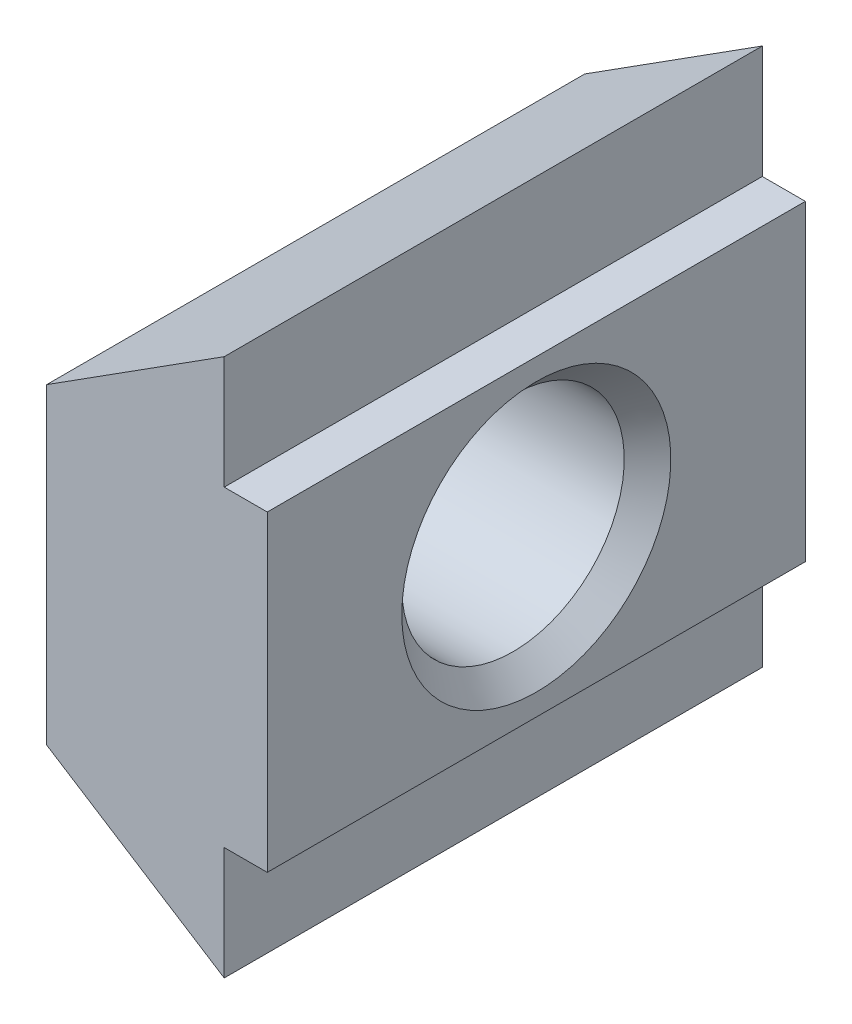
ISO-10303-21;
HEADER;
FILE_DESCRIPTION(('STEP AP214'),'2;1');
FILE_NAME('part.step','',(''),(''),'','','');
FILE_SCHEMA(('AUTOMOTIVE_DESIGN { 1 0 10303 214 1 1 1 1 }'));
ENDSEC;
DATA;
#1=APPLICATION_CONTEXT('core data for automotive mechanical design processes');
#2=APPLICATION_PROTOCOL_DEFINITION('international standard','automotive_design',2000,#1);
#3=PRODUCT_CONTEXT('',#1,'mechanical');
#4=PRODUCT('Part','Part','',(#3));
#5=PRODUCT_RELATED_PRODUCT_CATEGORY('part','',(#4));
#6=PRODUCT_DEFINITION_FORMATION('','',#4);
#7=PRODUCT_DEFINITION_CONTEXT('part definition',#1,'design');
#8=PRODUCT_DEFINITION('design','',#6,#7);
#9=PRODUCT_DEFINITION_SHAPE('','',#8);
#10=(LENGTH_UNIT() NAMED_UNIT(*) SI_UNIT(.MILLI.,.METRE.));
#11=(NAMED_UNIT(*) PLANE_ANGLE_UNIT() SI_UNIT($,.RADIAN.));
#12=(NAMED_UNIT(*) SI_UNIT($,.STERADIAN.) SOLID_ANGLE_UNIT());
#13=UNCERTAINTY_MEASURE_WITH_UNIT(LENGTH_MEASURE(1.E-05),#10,'distance_accuracy_value','');
#14=(GEOMETRIC_REPRESENTATION_CONTEXT(3) GLOBAL_UNCERTAINTY_ASSIGNED_CONTEXT((#13)) GLOBAL_UNIT_ASSIGNED_CONTEXT((#10,
#11,#12)) REPRESENTATION_CONTEXT('',''));
#15=CARTESIAN_POINT('',(0.,0.,0.));
#16=DIRECTION('',(0.,0.,1.));
#17=DIRECTION('',(1.,0.,0.));
#18=AXIS2_PLACEMENT_3D('',#15,#16,#17);
#19=CARTESIAN_POINT('',(-4.1,2.9,5.));
#20=DIRECTION('',(1.,0.,0.));
#21=DIRECTION('',(0.,0.,-1.));
#22=AXIS2_PLACEMENT_3D('',#19,#20,#21);
#23=PLANE('',#22);
#24=CARTESIAN_POINT('',(-4.1,0.,0.));
#25=DIRECTION('',(-1.,0.,0.));
#26=DIRECTION('',(0.,0.,1.));
#27=AXIS2_PLACEMENT_3D('',#24,#25,#26);
#28=CIRCLE('',#27,2.5);
#29=CARTESIAN_POINT('',(-4.1,0.,2.5));
#30=VERTEX_POINT('',#29);
#31=EDGE_CURVE('E122',#30,#30,#28,.T.);
#32=ORIENTED_EDGE('',*,*,#31,.F.);
#33=EDGE_LOOP('',(#32));
#34=FACE_BOUND('',#33,.T.);
#35=DIRECTION('',(0.,0.,-1.));
#36=VECTOR('',#35,1.);
#37=CARTESIAN_POINT('',(-4.1,2.9,5.));
#38=LINE('',#37,#36);
#39=CARTESIAN_POINT('',(-4.1,2.9,5.));
#40=VERTEX_POINT('',#39);
#41=CARTESIAN_POINT('',(-4.1,2.9,-5.));
#42=VERTEX_POINT('',#41);
#43=EDGE_CURVE('E121',#40,#42,#38,.T.);
#44=ORIENTED_EDGE('',*,*,#43,.T.);
#45=DIRECTION('',(0.,-1.,0.));
#46=VECTOR('',#45,1.);
#47=CARTESIAN_POINT('',(-4.1,2.9,-5.));
#48=LINE('',#47,#46);
#49=CARTESIAN_POINT('',(-4.1,-2.9,-5.));
#50=VERTEX_POINT('',#49);
#51=EDGE_CURVE('E115',#42,#50,#48,.T.);
#52=ORIENTED_EDGE('',*,*,#51,.T.);
#53=DIRECTION('',(0.,0.,-1.));
#54=VECTOR('',#53,1.);
#55=CARTESIAN_POINT('',(-4.1,-2.9,5.));
#56=LINE('',#55,#54);
#57=CARTESIAN_POINT('',(-4.1,-2.9,5.));
#58=VERTEX_POINT('',#57);
#59=EDGE_CURVE('E11',#58,#50,#56,.T.);
#60=ORIENTED_EDGE('',*,*,#59,.F.);
#61=DIRECTION('',(0.,-1.,0.));
#62=VECTOR('',#61,1.);
#63=CARTESIAN_POINT('',(-4.1,2.9,5.));
#64=LINE('',#63,#62);
#65=EDGE_CURVE('E144',#40,#58,#64,.T.);
#66=ORIENTED_EDGE('',*,*,#65,.F.);
#67=EDGE_LOOP('',(#44,#52,#60,#66));
#68=FACE_BOUND('',#67,.T.);
#69=ADVANCED_FACE('F39',(#34,#68),#23,.F.);
#70=CARTESIAN_POINT('',(-4.1,-2.9,5.));
#71=DIRECTION('',(0.536875492193159,0.843661487732107,0.));
#72=DIRECTION('',(-0.843661487732107,0.536875492193159,0.));
#73=AXIS2_PLACEMENT_3D('',#70,#71,#72);
#74=PLANE('',#73);
#75=ORIENTED_EDGE('',*,*,#59,.T.);
#76=DIRECTION('',(0.843661487732107,-0.536875492193159,0.));
#77=VECTOR('',#76,1.);
#78=CARTESIAN_POINT('',(-4.1,-2.9,-5.));
#79=LINE('',#78,#77);
#80=CARTESIAN_POINT('',(-0.800000000000001,-5.,-5.));
#81=VERTEX_POINT('',#80);
#82=EDGE_CURVE('E105',#50,#81,#79,.T.);
#83=ORIENTED_EDGE('',*,*,#82,.T.);
#84=DIRECTION('',(0.,0.,-1.));
#85=VECTOR('',#84,1.);
#86=CARTESIAN_POINT('',(-0.800000000000001,-5.,5.));
#87=LINE('',#86,#85);
#88=CARTESIAN_POINT('',(-0.800000000000001,-5.,5.));
#89=VERTEX_POINT('',#88);
#90=EDGE_CURVE('E46',#89,#81,#87,.T.);
#91=ORIENTED_EDGE('',*,*,#90,.F.);
#92=DIRECTION('',(0.843661487732107,-0.536875492193159,0.));
#93=VECTOR('',#92,1.);
#94=CARTESIAN_POINT('',(-4.1,-2.9,5.));
#95=LINE('',#94,#93);
#96=EDGE_CURVE('E106',#58,#89,#95,.T.);
#97=ORIENTED_EDGE('',*,*,#96,.F.);
#98=EDGE_LOOP('',(#75,#83,#91,#97));
#99=FACE_BOUND('',#98,.T.);
#100=ADVANCED_FACE('F103',(#99),#74,.F.);
#101=CARTESIAN_POINT('',(-0.800000000000001,-5.,5.));
#102=DIRECTION('',(-1.,0.,0.));
#103=DIRECTION('',(0.,0.,1.));
#104=AXIS2_PLACEMENT_3D('',#101,#102,#103);
#105=PLANE('',#104);
#106=ORIENTED_EDGE('',*,*,#90,.T.);
#107=DIRECTION('',(0.,1.,0.));
#108=VECTOR('',#107,1.);
#109=CARTESIAN_POINT('',(-0.800000000000001,-5.,-5.));
#110=LINE('',#109,#108);
#111=CARTESIAN_POINT('',(-0.800000000000001,-2.9,-5.));
#112=VERTEX_POINT('',#111);
#113=EDGE_CURVE('E119',#81,#112,#110,.T.);
#114=ORIENTED_EDGE('',*,*,#113,.T.);
#115=DIRECTION('',(0.,0.,-1.));
#116=VECTOR('',#115,1.);
#117=CARTESIAN_POINT('',(-0.800000000000001,-2.9,5.));
#118=LINE('',#117,#116);
#119=CARTESIAN_POINT('',(-0.800000000000001,-2.9,5.));
#120=VERTEX_POINT('',#119);
#121=EDGE_CURVE('E166',#120,#112,#118,.T.);
#122=ORIENTED_EDGE('',*,*,#121,.F.);
#123=DIRECTION('',(0.,1.,0.));
#124=VECTOR('',#123,1.);
#125=CARTESIAN_POINT('',(-0.800000000000001,-5.,5.));
#126=LINE('',#125,#124);
#127=EDGE_CURVE('E147',#89,#120,#126,.T.);
#128=ORIENTED_EDGE('',*,*,#127,.F.);
#129=EDGE_LOOP('',(#106,#114,#122,#128));
#130=FACE_BOUND('',#129,.T.);
#131=ADVANCED_FACE('F169',(#130),#105,.F.);
#132=CARTESIAN_POINT('',(-0.800000000000001,-2.9,5.));
#133=DIRECTION('',(0.,1.,0.));
#134=DIRECTION('',(0.,0.,1.));
#135=AXIS2_PLACEMENT_3D('',#132,#133,#134);
#136=PLANE('',#135);
#137=ORIENTED_EDGE('',*,*,#121,.T.);
#138=DIRECTION('',(1.,0.,0.));
#139=VECTOR('',#138,1.);
#140=CARTESIAN_POINT('',(-0.800000000000001,-2.9,-5.));
#141=LINE('',#140,#139);
#142=CARTESIAN_POINT('',(0.,-2.9,-5.));
#143=VERTEX_POINT('',#142);
#144=EDGE_CURVE('E130',#112,#143,#141,.T.);
#145=ORIENTED_EDGE('',*,*,#144,.T.);
#146=DIRECTION('',(0.,0.,-1.));
#147=VECTOR('',#146,1.);
#148=CARTESIAN_POINT('',(0.,-2.9,5.));
#149=LINE('',#148,#147);
#150=CARTESIAN_POINT('',(0.,-2.9,5.));
#151=VERTEX_POINT('',#150);
#152=EDGE_CURVE('E164',#151,#143,#149,.T.);
#153=ORIENTED_EDGE('',*,*,#152,.F.);
#154=DIRECTION('',(1.,0.,0.));
#155=VECTOR('',#154,1.);
#156=CARTESIAN_POINT('',(-0.800000000000001,-2.9,5.));
#157=LINE('',#156,#155);
#158=EDGE_CURVE('E149',#120,#151,#157,.T.);
#159=ORIENTED_EDGE('',*,*,#158,.F.);
#160=EDGE_LOOP('',(#137,#145,#153,#159));
#161=FACE_BOUND('',#160,.T.);
#162=ADVANCED_FACE('F177',(#161),#136,.F.);
#163=CARTESIAN_POINT('',(0.,-2.9,5.));
#164=DIRECTION('',(-1.,0.,0.));
#165=DIRECTION('',(0.,0.,1.));
#166=AXIS2_PLACEMENT_3D('',#163,#164,#165);
#167=PLANE('',#166);
#168=CARTESIAN_POINT('',(0.,0.,0.));
#169=DIRECTION('',(-1.,0.,0.));
#170=DIRECTION('',(0.,0.,1.));
#171=AXIS2_PLACEMENT_3D('',#168,#169,#170);
#172=CIRCLE('',#171,2.5);
#173=CARTESIAN_POINT('',(0.,0.,2.5));
#174=VERTEX_POINT('',#173);
#175=EDGE_CURVE('E216',#174,#174,#172,.T.);
#176=ORIENTED_EDGE('',*,*,#175,.T.);
#177=EDGE_LOOP('',(#176));
#178=FACE_BOUND('',#177,.T.);
#179=ORIENTED_EDGE('',*,*,#152,.T.);
#180=DIRECTION('',(0.,1.,0.));
#181=VECTOR('',#180,1.);
#182=CARTESIAN_POINT('',(0.,-2.9,-5.));
#183=LINE('',#182,#181);
#184=CARTESIAN_POINT('',(0.,2.9,-5.));
#185=VERTEX_POINT('',#184);
#186=EDGE_CURVE('E133',#143,#185,#183,.T.);
#187=ORIENTED_EDGE('',*,*,#186,.T.);
#188=DIRECTION('',(0.,0.,-1.));
#189=VECTOR('',#188,1.);
#190=CARTESIAN_POINT('',(0.,2.9,5.));
#191=LINE('',#190,#189);
#192=CARTESIAN_POINT('',(0.,2.9,5.));
#193=VERTEX_POINT('',#192);
#194=EDGE_CURVE('E162',#193,#185,#191,.T.);
#195=ORIENTED_EDGE('',*,*,#194,.F.);
#196=DIRECTION('',(0.,1.,0.));
#197=VECTOR('',#196,1.);
#198=CARTESIAN_POINT('',(0.,-2.9,5.));
#199=LINE('',#198,#197);
#200=EDGE_CURVE('E151',#151,#193,#199,.T.);
#201=ORIENTED_EDGE('',*,*,#200,.F.);
#202=EDGE_LOOP('',(#179,#187,#195,#201));
#203=FACE_BOUND('',#202,.T.);
#204=ADVANCED_FACE('F180',(#178,#203),#167,.F.);
#205=CARTESIAN_POINT('',(0.,2.9,5.));
#206=DIRECTION('',(0.,-1.,0.));
#207=DIRECTION('',(0.,0.,-1.));
#208=AXIS2_PLACEMENT_3D('',#205,#206,#207);
#209=PLANE('',#208);
#210=ORIENTED_EDGE('',*,*,#194,.T.);
#211=DIRECTION('',(-1.,0.,0.));
#212=VECTOR('',#211,1.);
#213=CARTESIAN_POINT('',(0.,2.9,-5.));
#214=LINE('',#213,#212);
#215=CARTESIAN_POINT('',(-0.8,2.9,-5.));
#216=VERTEX_POINT('',#215);
#217=EDGE_CURVE('E136',#185,#216,#214,.T.);
#218=ORIENTED_EDGE('',*,*,#217,.T.);
#219=DIRECTION('',(0.,0.,-1.));
#220=VECTOR('',#219,1.);
#221=CARTESIAN_POINT('',(-0.8,2.9,5.));
#222=LINE('',#221,#220);
#223=CARTESIAN_POINT('',(-0.8,2.9,5.));
#224=VERTEX_POINT('',#223);
#225=EDGE_CURVE('E160',#224,#216,#222,.T.);
#226=ORIENTED_EDGE('',*,*,#225,.F.);
#227=DIRECTION('',(-1.,0.,0.));
#228=VECTOR('',#227,1.);
#229=CARTESIAN_POINT('',(0.,2.9,5.));
#230=LINE('',#229,#228);
#231=EDGE_CURVE('E153',#193,#224,#230,.T.);
#232=ORIENTED_EDGE('',*,*,#231,.F.);
#233=EDGE_LOOP('',(#210,#218,#226,#232));
#234=FACE_BOUND('',#233,.T.);
#235=ADVANCED_FACE('F185',(#234),#209,.F.);
#236=CARTESIAN_POINT('',(-0.8,2.9,5.));
#237=DIRECTION('',(-1.,0.,0.));
#238=DIRECTION('',(0.,0.,1.));
#239=AXIS2_PLACEMENT_3D('',#236,#237,#238);
#240=PLANE('',#239);
#241=ORIENTED_EDGE('',*,*,#225,.T.);
#242=DIRECTION('',(0.,1.,0.));
#243=VECTOR('',#242,1.);
#244=CARTESIAN_POINT('',(-0.8,2.9,-5.));
#245=LINE('',#244,#243);
#246=CARTESIAN_POINT('',(-0.8,5.,-5.));
#247=VERTEX_POINT('',#246);
#248=EDGE_CURVE('E139',#216,#247,#245,.T.);
#249=ORIENTED_EDGE('',*,*,#248,.T.);
#250=DIRECTION('',(0.,0.,-1.));
#251=VECTOR('',#250,1.);
#252=CARTESIAN_POINT('',(-0.8,5.,5.));
#253=LINE('',#252,#251);
#254=CARTESIAN_POINT('',(-0.8,5.,5.));
#255=VERTEX_POINT('',#254);
#256=EDGE_CURVE('E158',#255,#247,#253,.T.);
#257=ORIENTED_EDGE('',*,*,#256,.F.);
#258=DIRECTION('',(0.,1.,0.));
#259=VECTOR('',#258,1.);
#260=CARTESIAN_POINT('',(-0.8,2.9,5.));
#261=LINE('',#260,#259);
#262=EDGE_CURVE('E58',#224,#255,#261,.T.);
#263=ORIENTED_EDGE('',*,*,#262,.F.);
#264=EDGE_LOOP('',(#241,#249,#257,#263));
#265=FACE_BOUND('',#264,.T.);
#266=ADVANCED_FACE('F188',(#265),#240,.F.);
#267=CARTESIAN_POINT('',(-0.8,5.,5.));
#268=DIRECTION('',(0.536875492193159,-0.843661487732107,0.));
#269=DIRECTION('',(0.843661487732108,0.536875492193159,0.));
#270=AXIS2_PLACEMENT_3D('',#267,#268,#269);
#271=PLANE('',#270);
#272=ORIENTED_EDGE('',*,*,#256,.T.);
#273=DIRECTION('',(-0.843661487732107,-0.536875492193159,0.));
#274=VECTOR('',#273,1.);
#275=CARTESIAN_POINT('',(-0.8,5.,-5.));
#276=LINE('',#275,#274);
#277=EDGE_CURVE('E142',#247,#42,#276,.T.);
#278=ORIENTED_EDGE('',*,*,#277,.T.);
#279=ORIENTED_EDGE('',*,*,#43,.F.);
#280=DIRECTION('',(-0.843661487732107,-0.536875492193159,0.));
#281=VECTOR('',#280,1.);
#282=CARTESIAN_POINT('',(-0.8,5.,5.));
#283=LINE('',#282,#281);
#284=EDGE_CURVE('E53',#255,#40,#283,.T.);
#285=ORIENTED_EDGE('',*,*,#284,.F.);
#286=EDGE_LOOP('',(#272,#278,#279,#285));
#287=FACE_BOUND('',#286,.T.);
#288=ADVANCED_FACE('F190',(#287),#271,.F.);
#289=CARTESIAN_POINT('',(0.,0.,5.));
#290=DIRECTION('',(0.,0.,1.));
#291=DIRECTION('',(1.,0.,0.));
#292=AXIS2_PLACEMENT_3D('',#289,#290,#291);
#293=PLANE('',#292);
#294=ORIENTED_EDGE('',*,*,#65,.T.);
#295=ORIENTED_EDGE('',*,*,#96,.T.);
#296=ORIENTED_EDGE('',*,*,#127,.T.);
#297=ORIENTED_EDGE('',*,*,#158,.T.);
#298=ORIENTED_EDGE('',*,*,#200,.T.);
#299=ORIENTED_EDGE('',*,*,#231,.T.);
#300=ORIENTED_EDGE('',*,*,#262,.T.);
#301=ORIENTED_EDGE('',*,*,#284,.T.);
#302=EDGE_LOOP('',(#294,#295,#296,#297,#298,#299,#300,#301));
#303=FACE_BOUND('',#302,.T.);
#304=ADVANCED_FACE('F172',(#303),#293,.T.);
#305=CARTESIAN_POINT('',(0.,0.,-5.));
#306=DIRECTION('',(0.,0.,1.));
#307=DIRECTION('',(1.,0.,0.));
#308=AXIS2_PLACEMENT_3D('',#305,#306,#307);
#309=PLANE('',#308);
#310=ORIENTED_EDGE('',*,*,#51,.F.);
#311=ORIENTED_EDGE('',*,*,#277,.F.);
#312=ORIENTED_EDGE('',*,*,#248,.F.);
#313=ORIENTED_EDGE('',*,*,#217,.F.);
#314=ORIENTED_EDGE('',*,*,#186,.F.);
#315=ORIENTED_EDGE('',*,*,#144,.F.);
#316=ORIENTED_EDGE('',*,*,#113,.F.);
#317=ORIENTED_EDGE('',*,*,#82,.F.);
#318=EDGE_LOOP('',(#310,#311,#312,#313,#314,#315,#316,#317));
#319=FACE_BOUND('',#318,.T.);
#320=ADVANCED_FACE('F113',(#319),#309,.F.);
#321=CARTESIAN_POINT('',(-3.667,0.,0.));
#322=DIRECTION('',(-1.,0.,0.));
#323=DIRECTION('',(0.,0.,1.));
#324=AXIS2_PLACEMENT_3D('',#321,#322,#323);
#325=CONICAL_SURFACE('',#324,2.067,0.785398163397448);
#326=ORIENTED_EDGE('',*,*,#31,.T.);
#327=EDGE_LOOP('',(#326));
#328=FACE_BOUND('',#327,.T.);
#329=CARTESIAN_POINT('',(-3.667,0.,0.));
#330=DIRECTION('',(-1.,0.,0.));
#331=DIRECTION('',(0.,0.,1.));
#332=AXIS2_PLACEMENT_3D('',#329,#330,#331);
#333=CIRCLE('',#332,2.067);
#334=CARTESIAN_POINT('',(-3.667,0.,2.067));
#335=VERTEX_POINT('',#334);
#336=EDGE_CURVE('E125',#335,#335,#333,.T.);
#337=ORIENTED_EDGE('',*,*,#336,.F.);
#338=EDGE_LOOP('',(#337));
#339=FACE_BOUND('',#338,.T.);
#340=ADVANCED_FACE('F206',(#328,#339),#325,.F.);
#341=CARTESIAN_POINT('',(0.,0.,0.));
#342=DIRECTION('',(-1.,0.,0.));
#343=DIRECTION('',(0.,0.,1.));
#344=AXIS2_PLACEMENT_3D('',#341,#342,#343);
#345=CYLINDRICAL_SURFACE('',#344,2.067);
#346=ORIENTED_EDGE('',*,*,#336,.T.);
#347=EDGE_LOOP('',(#346));
#348=FACE_BOUND('',#347,.T.);
#349=CARTESIAN_POINT('',(-0.433,0.,0.));
#350=DIRECTION('',(-1.,0.,0.));
#351=DIRECTION('',(0.,0.,1.));
#352=AXIS2_PLACEMENT_3D('',#349,#350,#351);
#353=CIRCLE('',#352,2.067);
#354=CARTESIAN_POINT('',(-0.433,0.,2.067));
#355=VERTEX_POINT('',#354);
#356=EDGE_CURVE('E214',#355,#355,#353,.T.);
#357=ORIENTED_EDGE('',*,*,#356,.F.);
#358=EDGE_LOOP('',(#357));
#359=FACE_BOUND('',#358,.T.);
#360=ADVANCED_FACE('F209',(#348,#359),#345,.F.);
#361=CARTESIAN_POINT('',(0.,0.,0.));
#362=DIRECTION('',(1.,0.,0.));
#363=DIRECTION('',(0.,0.,-1.));
#364=AXIS2_PLACEMENT_3D('',#361,#362,#363);
#365=CONICAL_SURFACE('',#364,2.5,0.785398163397448);
#366=ORIENTED_EDGE('',*,*,#356,.T.);
#367=EDGE_LOOP('',(#366));
#368=FACE_BOUND('',#367,.T.);
#369=ORIENTED_EDGE('',*,*,#175,.F.);
#370=EDGE_LOOP('',(#369));
#371=FACE_BOUND('',#370,.T.);
#372=ADVANCED_FACE('F223',(#368,#371),#365,.F.);
#373=CLOSED_SHELL('',(#69,#100,#131,#162,#204,#235,#266,#288,#304,#320,#340,#360,#372));
#374=MANIFOLD_SOLID_BREP('B2',#373);
#375=ADVANCED_BREP_SHAPE_REPRESENTATION('',(#18,#374),#14);
#376=SHAPE_DEFINITION_REPRESENTATION(#9,#375);
ENDSEC;
END-ISO-10303-21;
